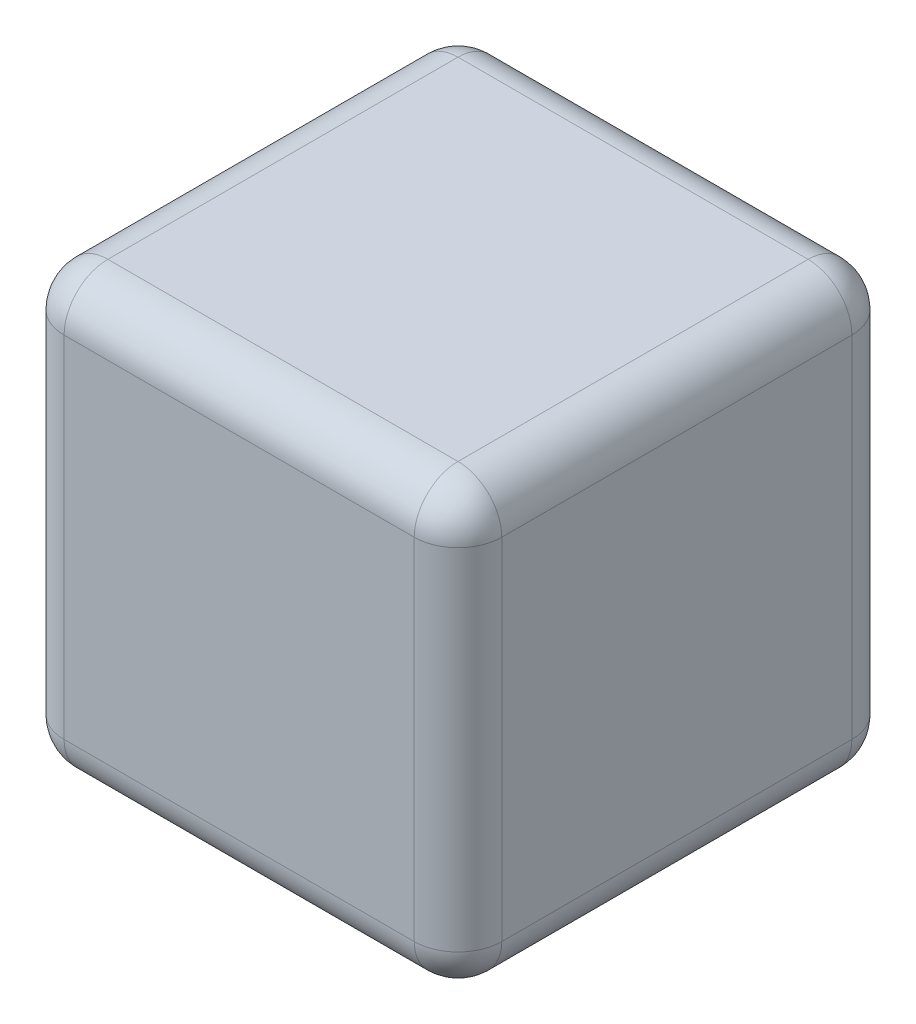
ISO-10303-21;
HEADER;
FILE_DESCRIPTION(('STEP AP214'),'2;1');
FILE_NAME('part.step','',(''),(''),'','','');
FILE_SCHEMA(('AUTOMOTIVE_DESIGN { 1 0 10303 214 1 1 1 1 }'));
ENDSEC;
DATA;
#1=APPLICATION_CONTEXT('core data for automotive mechanical design processes');
#2=APPLICATION_PROTOCOL_DEFINITION('international standard','automotive_design',2000,#1);
#3=PRODUCT_CONTEXT('',#1,'mechanical');
#4=PRODUCT('Part','Part','',(#3));
#5=PRODUCT_RELATED_PRODUCT_CATEGORY('part','',(#4));
#6=PRODUCT_DEFINITION_FORMATION('','',#4);
#7=PRODUCT_DEFINITION_CONTEXT('part definition',#1,'design');
#8=PRODUCT_DEFINITION('design','',#6,#7);
#9=PRODUCT_DEFINITION_SHAPE('','',#8);
#10=(LENGTH_UNIT() NAMED_UNIT(*) SI_UNIT(.MILLI.,.METRE.));
#11=(NAMED_UNIT(*) PLANE_ANGLE_UNIT() SI_UNIT($,.RADIAN.));
#12=(NAMED_UNIT(*) SI_UNIT($,.STERADIAN.) SOLID_ANGLE_UNIT());
#13=UNCERTAINTY_MEASURE_WITH_UNIT(LENGTH_MEASURE(1.E-05),#10,'distance_accuracy_value','');
#14=(GEOMETRIC_REPRESENTATION_CONTEXT(3) GLOBAL_UNCERTAINTY_ASSIGNED_CONTEXT((#13)) GLOBAL_UNIT_ASSIGNED_CONTEXT((#10,
#11,#12)) REPRESENTATION_CONTEXT('',''));
#15=CARTESIAN_POINT('',(0.,0.,0.));
#16=DIRECTION('',(0.,0.,1.));
#17=DIRECTION('',(1.,0.,0.));
#18=AXIS2_PLACEMENT_3D('',#15,#16,#17);
#19=CARTESIAN_POINT('',(0.,63.5,0.));
#20=DIRECTION('',(1.,0.,0.));
#21=DIRECTION('',(0.,0.,-1.));
#22=AXIS2_PLACEMENT_3D('',#19,#20,#21);
#23=PLANE('',#22);
#24=DIRECTION('',(0.,0.,1.));
#25=VECTOR('',#24,1.);
#26=CARTESIAN_POINT('',(0.,6.35,0.));
#27=LINE('',#26,#25);
#28=CARTESIAN_POINT('',(0.,6.35,6.35));
#29=VERTEX_POINT('',#28);
#30=CARTESIAN_POINT('',(0.,6.35,57.15));
#31=VERTEX_POINT('',#30);
#32=EDGE_CURVE('E181',#29,#31,#27,.T.);
#33=ORIENTED_EDGE('',*,*,#32,.T.);
#34=DIRECTION('',(0.,-1.,0.));
#35=VECTOR('',#34,1.);
#36=CARTESIAN_POINT('',(0.,63.5,57.15));
#37=LINE('',#36,#35);
#38=CARTESIAN_POINT('',(0.,57.15,57.15));
#39=VERTEX_POINT('',#38);
#40=EDGE_CURVE('E190',#31,#39,#37,.F.);
#41=ORIENTED_EDGE('',*,*,#40,.T.);
#42=DIRECTION('',(0.,0.,1.));
#43=VECTOR('',#42,1.);
#44=CARTESIAN_POINT('',(0.,57.15,0.));
#45=LINE('',#44,#43);
#46=CARTESIAN_POINT('',(0.,57.15,6.35));
#47=VERTEX_POINT('',#46);
#48=EDGE_CURVE('E187',#39,#47,#45,.F.);
#49=ORIENTED_EDGE('',*,*,#48,.T.);
#50=DIRECTION('',(0.,-1.,0.));
#51=VECTOR('',#50,1.);
#52=CARTESIAN_POINT('',(0.,63.5,6.35));
#53=LINE('',#52,#51);
#54=EDGE_CURVE('E184',#47,#29,#53,.T.);
#55=ORIENTED_EDGE('',*,*,#54,.T.);
#56=EDGE_LOOP('',(#33,#41,#49,#55));
#57=FACE_BOUND('',#56,.T.);
#58=ADVANCED_FACE('F38',(#57),#23,.F.);
#59=CARTESIAN_POINT('',(0.,63.5,63.5));
#60=DIRECTION('',(0.,0.,-1.));
#61=DIRECTION('',(-1.,0.,0.));
#62=AXIS2_PLACEMENT_3D('',#59,#60,#61);
#63=PLANE('',#62);
#64=DIRECTION('',(0.,-1.,0.));
#65=VECTOR('',#64,1.);
#66=CARTESIAN_POINT('',(6.35,63.5,63.5));
#67=LINE('',#66,#65);
#68=CARTESIAN_POINT('',(6.35,57.15,63.5));
#69=VERTEX_POINT('',#68);
#70=CARTESIAN_POINT('',(6.35,6.35,63.5));
#71=VERTEX_POINT('',#70);
#72=EDGE_CURVE('E143',#69,#71,#67,.T.);
#73=ORIENTED_EDGE('',*,*,#72,.T.);
#74=DIRECTION('',(1.,0.,0.));
#75=VECTOR('',#74,1.);
#76=CARTESIAN_POINT('',(0.,6.35,63.5));
#77=LINE('',#76,#75);
#78=CARTESIAN_POINT('',(57.15,6.35,63.5));
#79=VERTEX_POINT('',#78);
#80=EDGE_CURVE('E138',#71,#79,#77,.T.);
#81=ORIENTED_EDGE('',*,*,#80,.T.);
#82=DIRECTION('',(0.,-1.,0.));
#83=VECTOR('',#82,1.);
#84=CARTESIAN_POINT('',(57.15,63.5,63.5));
#85=LINE('',#84,#83);
#86=CARTESIAN_POINT('',(57.15,57.15,63.5));
#87=VERTEX_POINT('',#86);
#88=EDGE_CURVE('E130',#79,#87,#85,.F.);
#89=ORIENTED_EDGE('',*,*,#88,.T.);
#90=DIRECTION('',(1.,0.,0.));
#91=VECTOR('',#90,1.);
#92=CARTESIAN_POINT('',(0.,57.15,63.5));
#93=LINE('',#92,#91);
#94=EDGE_CURVE('E135',#87,#69,#93,.F.);
#95=ORIENTED_EDGE('',*,*,#94,.T.);
#96=EDGE_LOOP('',(#73,#81,#89,#95));
#97=FACE_BOUND('',#96,.T.);
#98=ADVANCED_FACE('F133',(#97),#63,.F.);
#99=CARTESIAN_POINT('',(63.5,63.5,0.));
#100=DIRECTION('',(-1.,0.,0.));
#101=DIRECTION('',(0.,0.,1.));
#102=AXIS2_PLACEMENT_3D('',#99,#100,#101);
#103=PLANE('',#102);
#104=DIRECTION('',(0.,0.,-1.));
#105=VECTOR('',#104,1.);
#106=CARTESIAN_POINT('',(63.5,57.15,63.5));
#107=LINE('',#106,#105);
#108=CARTESIAN_POINT('',(63.5,57.15,6.35));
#109=VERTEX_POINT('',#108);
#110=CARTESIAN_POINT('',(63.5,57.15,57.15));
#111=VERTEX_POINT('',#110);
#112=EDGE_CURVE('E200',#109,#111,#107,.F.);
#113=ORIENTED_EDGE('',*,*,#112,.T.);
#114=DIRECTION('',(0.,-1.,0.));
#115=VECTOR('',#114,1.);
#116=CARTESIAN_POINT('',(63.5,63.5,57.15));
#117=LINE('',#116,#115);
#118=CARTESIAN_POINT('',(63.5,6.35,57.15));
#119=VERTEX_POINT('',#118);
#120=EDGE_CURVE('E151',#111,#119,#117,.T.);
#121=ORIENTED_EDGE('',*,*,#120,.T.);
#122=DIRECTION('',(0.,0.,-1.));
#123=VECTOR('',#122,1.);
#124=CARTESIAN_POINT('',(63.5,6.35,0.));
#125=LINE('',#124,#123);
#126=CARTESIAN_POINT('',(63.5,6.35,6.35));
#127=VERTEX_POINT('',#126);
#128=EDGE_CURVE('E197',#119,#127,#125,.T.);
#129=ORIENTED_EDGE('',*,*,#128,.T.);
#130=DIRECTION('',(0.,-1.,0.));
#131=VECTOR('',#130,1.);
#132=CARTESIAN_POINT('',(63.5,63.5,6.35));
#133=LINE('',#132,#131);
#134=EDGE_CURVE('E194',#127,#109,#133,.F.);
#135=ORIENTED_EDGE('',*,*,#134,.T.);
#136=EDGE_LOOP('',(#113,#121,#129,#135));
#137=FACE_BOUND('',#136,.T.);
#138=ADVANCED_FACE('F363',(#137),#103,.F.);
#139=CARTESIAN_POINT('',(0.,63.5,0.));
#140=DIRECTION('',(0.,0.,1.));
#141=DIRECTION('',(1.,0.,0.));
#142=AXIS2_PLACEMENT_3D('',#139,#140,#141);
#143=PLANE('',#142);
#144=DIRECTION('',(0.,-1.,0.));
#145=VECTOR('',#144,1.);
#146=CARTESIAN_POINT('',(6.35,63.5,0.));
#147=LINE('',#146,#145);
#148=CARTESIAN_POINT('',(6.35,6.35,0.));
#149=VERTEX_POINT('',#148);
#150=CARTESIAN_POINT('',(6.35,57.15,0.));
#151=VERTEX_POINT('',#150);
#152=EDGE_CURVE('E63',#149,#151,#147,.F.);
#153=ORIENTED_EDGE('',*,*,#152,.T.);
#154=DIRECTION('',(-1.,0.,0.));
#155=VECTOR('',#154,1.);
#156=CARTESIAN_POINT('',(63.5,57.15,0.));
#157=LINE('',#156,#155);
#158=CARTESIAN_POINT('',(57.15,57.15,0.));
#159=VERTEX_POINT('',#158);
#160=EDGE_CURVE('E11',#151,#159,#157,.F.);
#161=ORIENTED_EDGE('',*,*,#160,.T.);
#162=DIRECTION('',(0.,-1.,0.));
#163=VECTOR('',#162,1.);
#164=CARTESIAN_POINT('',(57.15,63.5,0.));
#165=LINE('',#164,#163);
#166=CARTESIAN_POINT('',(57.15,6.35,0.));
#167=VERTEX_POINT('',#166);
#168=EDGE_CURVE('E48',#159,#167,#165,.T.);
#169=ORIENTED_EDGE('',*,*,#168,.T.);
#170=DIRECTION('',(-1.,0.,0.));
#171=VECTOR('',#170,1.);
#172=CARTESIAN_POINT('',(0.,6.35,0.));
#173=LINE('',#172,#171);
#174=EDGE_CURVE('E231',#167,#149,#173,.T.);
#175=ORIENTED_EDGE('',*,*,#174,.T.);
#176=EDGE_LOOP('',(#153,#161,#169,#175));
#177=FACE_BOUND('',#176,.T.);
#178=ADVANCED_FACE('F328',(#177),#143,.F.);
#179=CARTESIAN_POINT('',(0.,63.5,0.));
#180=DIRECTION('',(0.,1.,0.));
#181=DIRECTION('',(0.,0.,1.));
#182=AXIS2_PLACEMENT_3D('',#179,#180,#181);
#183=PLANE('',#182);
#184=DIRECTION('',(0.,0.,-1.));
#185=VECTOR('',#184,1.);
#186=CARTESIAN_POINT('',(57.15,63.5,0.));
#187=LINE('',#186,#185);
#188=CARTESIAN_POINT('',(57.15,63.5,57.15));
#189=VERTEX_POINT('',#188);
#190=CARTESIAN_POINT('',(57.15,63.5,6.35));
#191=VERTEX_POINT('',#190);
#192=EDGE_CURVE('E224',#189,#191,#187,.T.);
#193=ORIENTED_EDGE('',*,*,#192,.T.);
#194=DIRECTION('',(-1.,0.,0.));
#195=VECTOR('',#194,1.);
#196=CARTESIAN_POINT('',(0.,63.5,6.35));
#197=LINE('',#196,#195);
#198=CARTESIAN_POINT('',(6.35,63.5,6.35));
#199=VERTEX_POINT('',#198);
#200=EDGE_CURVE('E227',#191,#199,#197,.T.);
#201=ORIENTED_EDGE('',*,*,#200,.T.);
#202=DIRECTION('',(0.,0.,1.));
#203=VECTOR('',#202,1.);
#204=CARTESIAN_POINT('',(6.35,63.5,63.5));
#205=LINE('',#204,#203);
#206=CARTESIAN_POINT('',(6.35,63.5,57.15));
#207=VERTEX_POINT('',#206);
#208=EDGE_CURVE('E218',#199,#207,#205,.T.);
#209=ORIENTED_EDGE('',*,*,#208,.T.);
#210=DIRECTION('',(1.,0.,0.));
#211=VECTOR('',#210,1.);
#212=CARTESIAN_POINT('',(63.5,63.5,57.15));
#213=LINE('',#212,#211);
#214=EDGE_CURVE('E221',#207,#189,#213,.T.);
#215=ORIENTED_EDGE('',*,*,#214,.T.);
#216=EDGE_LOOP('',(#193,#201,#209,#215));
#217=FACE_BOUND('',#216,.T.);
#218=ADVANCED_FACE('F341',(#217),#183,.T.);
#219=CARTESIAN_POINT('',(0.,0.,0.));
#220=DIRECTION('',(0.,1.,0.));
#221=DIRECTION('',(0.,0.,1.));
#222=AXIS2_PLACEMENT_3D('',#219,#220,#221);
#223=PLANE('',#222);
#224=DIRECTION('',(0.,0.,-1.));
#225=VECTOR('',#224,1.);
#226=CARTESIAN_POINT('',(57.15,0.,0.));
#227=LINE('',#226,#225);
#228=CARTESIAN_POINT('',(57.15,0.,6.35));
#229=VERTEX_POINT('',#228);
#230=CARTESIAN_POINT('',(57.15,0.,57.15));
#231=VERTEX_POINT('',#230);
#232=EDGE_CURVE('E211',#229,#231,#227,.F.);
#233=ORIENTED_EDGE('',*,*,#232,.T.);
#234=DIRECTION('',(1.,0.,0.));
#235=VECTOR('',#234,1.);
#236=CARTESIAN_POINT('',(0.,0.,57.15));
#237=LINE('',#236,#235);
#238=CARTESIAN_POINT('',(6.35,0.,57.15));
#239=VERTEX_POINT('',#238);
#240=EDGE_CURVE('E214',#231,#239,#237,.F.);
#241=ORIENTED_EDGE('',*,*,#240,.T.);
#242=DIRECTION('',(0.,0.,1.));
#243=VECTOR('',#242,1.);
#244=CARTESIAN_POINT('',(6.35,0.,0.));
#245=LINE('',#244,#243);
#246=CARTESIAN_POINT('',(6.35,0.,6.35));
#247=VERTEX_POINT('',#246);
#248=EDGE_CURVE('E208',#239,#247,#245,.F.);
#249=ORIENTED_EDGE('',*,*,#248,.T.);
#250=DIRECTION('',(-1.,0.,0.));
#251=VECTOR('',#250,1.);
#252=CARTESIAN_POINT('',(0.,0.,6.35));
#253=LINE('',#252,#251);
#254=EDGE_CURVE('E205',#247,#229,#253,.F.);
#255=ORIENTED_EDGE('',*,*,#254,.T.);
#256=EDGE_LOOP('',(#233,#241,#249,#255));
#257=FACE_BOUND('',#256,.T.);
#258=ADVANCED_FACE('F321',(#257),#223,.F.);
#259=CARTESIAN_POINT('',(57.15,63.5,6.35));
#260=DIRECTION('',(0.,-1.,0.));
#261=DIRECTION('',(0.,0.,-1.));
#262=AXIS2_PLACEMENT_3D('',#259,#260,#261);
#263=CYLINDRICAL_SURFACE('',#262,6.35);
#264=CARTESIAN_POINT('',(57.15,57.15,6.35));
#265=DIRECTION('',(0.,1.,0.));
#266=DIRECTION('',(0.,0.,1.));
#267=AXIS2_PLACEMENT_3D('',#264,#265,#266);
#268=CIRCLE('',#267,6.35);
#269=EDGE_CURVE('E42',#109,#159,#268,.T.);
#270=ORIENTED_EDGE('',*,*,#269,.F.);
#271=ORIENTED_EDGE('',*,*,#134,.F.);
#272=CARTESIAN_POINT('',(57.15,6.35,6.35));
#273=DIRECTION('',(0.,-1.,0.));
#274=DIRECTION('',(0.,0.,-1.));
#275=AXIS2_PLACEMENT_3D('',#272,#273,#274);
#276=CIRCLE('',#275,6.35);
#277=EDGE_CURVE('E175',#167,#127,#276,.T.);
#278=ORIENTED_EDGE('',*,*,#277,.F.);
#279=ORIENTED_EDGE('',*,*,#168,.F.);
#280=EDGE_LOOP('',(#270,#271,#278,#279));
#281=FACE_BOUND('',#280,.T.);
#282=ADVANCED_FACE('F40',(#281),#263,.T.);
#283=CARTESIAN_POINT('',(57.15,57.15,6.35));
#284=DIRECTION('',(0.,0.,-1.));
#285=DIRECTION('',(-1.,0.,0.));
#286=AXIS2_PLACEMENT_3D('',#283,#284,#285);
#287=SPHERICAL_SURFACE('',#286,6.35);
#288=CARTESIAN_POINT('',(57.15,57.15,6.35));
#289=DIRECTION('',(0.,0.,-1.));
#290=DIRECTION('',(-1.,0.,0.));
#291=AXIS2_PLACEMENT_3D('',#288,#289,#290);
#292=CIRCLE('',#291,6.35);
#293=EDGE_CURVE('E298',#109,#191,#292,.F.);
#294=ORIENTED_EDGE('',*,*,#293,.F.);
#295=ORIENTED_EDGE('',*,*,#269,.T.);
#296=CARTESIAN_POINT('',(57.15,57.15,6.35));
#297=DIRECTION('',(1.,0.,0.));
#298=DIRECTION('',(0.,0.,-1.));
#299=AXIS2_PLACEMENT_3D('',#296,#297,#298);
#300=CIRCLE('',#299,6.35);
#301=EDGE_CURVE('E56',#191,#159,#300,.F.);
#302=ORIENTED_EDGE('',*,*,#301,.F.);
#303=EDGE_LOOP('',(#294,#295,#302));
#304=FACE_BOUND('',#303,.T.);
#305=ADVANCED_FACE('F348',(#304),#287,.T.);
#306=CARTESIAN_POINT('',(57.15,6.35,6.35));
#307=DIRECTION('',(1.,0.,0.));
#308=DIRECTION('',(0.,1.,0.));
#309=AXIS2_PLACEMENT_3D('',#306,#307,#308);
#310=SPHERICAL_SURFACE('',#309,6.35);
#311=CARTESIAN_POINT('',(57.15,6.35,6.35));
#312=DIRECTION('',(1.,0.,0.));
#313=DIRECTION('',(0.,0.,-1.));
#314=AXIS2_PLACEMENT_3D('',#311,#312,#313);
#315=CIRCLE('',#314,6.35);
#316=EDGE_CURVE('E290',#167,#229,#315,.F.);
#317=ORIENTED_EDGE('',*,*,#316,.F.);
#318=ORIENTED_EDGE('',*,*,#277,.T.);
#319=CARTESIAN_POINT('',(57.15,6.35,6.35));
#320=DIRECTION('',(0.,0.,-1.));
#321=DIRECTION('',(-1.,0.,0.));
#322=AXIS2_PLACEMENT_3D('',#319,#320,#321);
#323=CIRCLE('',#322,6.35);
#324=EDGE_CURVE('E294',#229,#127,#323,.F.);
#325=ORIENTED_EDGE('',*,*,#324,.F.);
#326=EDGE_LOOP('',(#317,#318,#325));
#327=FACE_BOUND('',#326,.T.);
#328=ADVANCED_FACE('F309',(#327),#310,.T.);
#329=CARTESIAN_POINT('',(0.,57.15,6.35));
#330=DIRECTION('',(1.,0.,0.));
#331=DIRECTION('',(0.,0.,-1.));
#332=AXIS2_PLACEMENT_3D('',#329,#330,#331);
#333=CYLINDRICAL_SURFACE('',#332,6.35);
#334=ORIENTED_EDGE('',*,*,#301,.T.);
#335=ORIENTED_EDGE('',*,*,#160,.F.);
#336=CARTESIAN_POINT('',(6.35,57.15,6.35));
#337=DIRECTION('',(-1.,0.,0.));
#338=DIRECTION('',(0.,0.,1.));
#339=AXIS2_PLACEMENT_3D('',#336,#337,#338);
#340=CIRCLE('',#339,6.35);
#341=EDGE_CURVE('E282',#199,#151,#340,.T.);
#342=ORIENTED_EDGE('',*,*,#341,.F.);
#343=ORIENTED_EDGE('',*,*,#200,.F.);
#344=EDGE_LOOP('',(#334,#335,#342,#343));
#345=FACE_BOUND('',#344,.T.);
#346=ADVANCED_FACE('F339',(#345),#333,.T.);
#347=CARTESIAN_POINT('',(57.15,57.15,0.));
#348=DIRECTION('',(0.,0.,1.));
#349=DIRECTION('',(1.,0.,0.));
#350=AXIS2_PLACEMENT_3D('',#347,#348,#349);
#351=CYLINDRICAL_SURFACE('',#350,6.35);
#352=ORIENTED_EDGE('',*,*,#293,.T.);
#353=ORIENTED_EDGE('',*,*,#192,.F.);
#354=CARTESIAN_POINT('',(57.15,57.15,57.15));
#355=DIRECTION('',(0.,0.,1.));
#356=DIRECTION('',(1.,0.,0.));
#357=AXIS2_PLACEMENT_3D('',#354,#355,#356);
#358=CIRCLE('',#357,6.35);
#359=EDGE_CURVE('E156',#111,#189,#358,.T.);
#360=ORIENTED_EDGE('',*,*,#359,.F.);
#361=ORIENTED_EDGE('',*,*,#112,.F.);
#362=EDGE_LOOP('',(#352,#353,#360,#361));
#363=FACE_BOUND('',#362,.T.);
#364=ADVANCED_FACE('F346',(#363),#351,.T.);
#365=CARTESIAN_POINT('',(57.15,63.5,57.15));
#366=DIRECTION('',(0.,-1.,0.));
#367=DIRECTION('',(0.,0.,-1.));
#368=AXIS2_PLACEMENT_3D('',#365,#366,#367);
#369=CYLINDRICAL_SURFACE('',#368,6.35);
#370=CARTESIAN_POINT('',(57.15,6.35,57.15));
#371=DIRECTION('',(0.,-1.,0.));
#372=DIRECTION('',(0.,0.,-1.));
#373=AXIS2_PLACEMENT_3D('',#370,#371,#372);
#374=CIRCLE('',#373,6.35);
#375=EDGE_CURVE('E157',#119,#79,#374,.T.);
#376=ORIENTED_EDGE('',*,*,#375,.F.);
#377=ORIENTED_EDGE('',*,*,#120,.F.);
#378=CARTESIAN_POINT('',(57.15,57.15,57.15));
#379=DIRECTION('',(0.,1.,0.));
#380=DIRECTION('',(0.,0.,1.));
#381=AXIS2_PLACEMENT_3D('',#378,#379,#380);
#382=CIRCLE('',#381,6.35);
#383=EDGE_CURVE('E147',#87,#111,#382,.T.);
#384=ORIENTED_EDGE('',*,*,#383,.F.);
#385=ORIENTED_EDGE('',*,*,#88,.F.);
#386=EDGE_LOOP('',(#376,#377,#384,#385));
#387=FACE_BOUND('',#386,.T.);
#388=ADVANCED_FACE('F149',(#387),#369,.T.);
#389=CARTESIAN_POINT('',(57.15,6.35,0.));
#390=DIRECTION('',(0.,0.,-1.));
#391=DIRECTION('',(-1.,0.,0.));
#392=AXIS2_PLACEMENT_3D('',#389,#390,#391);
#393=CYLINDRICAL_SURFACE('',#392,6.35);
#394=ORIENTED_EDGE('',*,*,#324,.T.);
#395=ORIENTED_EDGE('',*,*,#128,.F.);
#396=CARTESIAN_POINT('',(57.15,6.35,57.15));
#397=DIRECTION('',(0.,0.,1.));
#398=DIRECTION('',(1.,0.,0.));
#399=AXIS2_PLACEMENT_3D('',#396,#397,#398);
#400=CIRCLE('',#399,6.35);
#401=EDGE_CURVE('E275',#231,#119,#400,.T.);
#402=ORIENTED_EDGE('',*,*,#401,.F.);
#403=ORIENTED_EDGE('',*,*,#232,.F.);
#404=EDGE_LOOP('',(#394,#395,#402,#403));
#405=FACE_BOUND('',#404,.T.);
#406=ADVANCED_FACE('F317',(#405),#393,.T.);
#407=CARTESIAN_POINT('',(0.,6.35,6.35));
#408=DIRECTION('',(-1.,0.,0.));
#409=DIRECTION('',(0.,0.,1.));
#410=AXIS2_PLACEMENT_3D('',#407,#408,#409);
#411=CYLINDRICAL_SURFACE('',#410,6.35);
#412=ORIENTED_EDGE('',*,*,#316,.T.);
#413=ORIENTED_EDGE('',*,*,#254,.F.);
#414=CARTESIAN_POINT('',(6.35,6.35,6.35));
#415=DIRECTION('',(-1.,0.,0.));
#416=DIRECTION('',(0.,0.,1.));
#417=AXIS2_PLACEMENT_3D('',#414,#415,#416);
#418=CIRCLE('',#417,6.35);
#419=EDGE_CURVE('E271',#149,#247,#418,.T.);
#420=ORIENTED_EDGE('',*,*,#419,.F.);
#421=ORIENTED_EDGE('',*,*,#174,.F.);
#422=EDGE_LOOP('',(#412,#413,#420,#421));
#423=FACE_BOUND('',#422,.T.);
#424=ADVANCED_FACE('F327',(#423),#411,.T.);
#425=CARTESIAN_POINT('',(6.35,63.5,6.35));
#426=DIRECTION('',(0.,-1.,0.));
#427=DIRECTION('',(0.,0.,-1.));
#428=AXIS2_PLACEMENT_3D('',#425,#426,#427);
#429=CYLINDRICAL_SURFACE('',#428,6.35);
#430=CARTESIAN_POINT('',(6.35,57.15,6.35));
#431=DIRECTION('',(0.,1.,0.));
#432=DIRECTION('',(0.,0.,1.));
#433=AXIS2_PLACEMENT_3D('',#430,#431,#432);
#434=CIRCLE('',#433,6.35);
#435=EDGE_CURVE('E286',#151,#47,#434,.T.);
#436=ORIENTED_EDGE('',*,*,#435,.F.);
#437=ORIENTED_EDGE('',*,*,#152,.F.);
#438=CARTESIAN_POINT('',(6.35,6.35,6.35));
#439=DIRECTION('',(0.,-1.,0.));
#440=DIRECTION('',(0.,0.,-1.));
#441=AXIS2_PLACEMENT_3D('',#438,#439,#440);
#442=CIRCLE('',#441,6.35);
#443=EDGE_CURVE('E267',#29,#149,#442,.T.);
#444=ORIENTED_EDGE('',*,*,#443,.F.);
#445=ORIENTED_EDGE('',*,*,#54,.F.);
#446=EDGE_LOOP('',(#436,#437,#444,#445));
#447=FACE_BOUND('',#446,.T.);
#448=ADVANCED_FACE('F332',(#447),#429,.T.);
#449=CARTESIAN_POINT('',(6.35,57.15,6.35));
#450=DIRECTION('',(0.,0.,-1.));
#451=DIRECTION('',(-1.,0.,0.));
#452=AXIS2_PLACEMENT_3D('',#449,#450,#451);
#453=SPHERICAL_SURFACE('',#452,6.35);
#454=ORIENTED_EDGE('',*,*,#341,.T.);
#455=ORIENTED_EDGE('',*,*,#435,.T.);
#456=CARTESIAN_POINT('',(6.35,57.15,6.35));
#457=DIRECTION('',(0.,0.,-1.));
#458=DIRECTION('',(-1.,0.,0.));
#459=AXIS2_PLACEMENT_3D('',#456,#457,#458);
#460=CIRCLE('',#459,6.35);
#461=EDGE_CURVE('E165',#199,#47,#460,.F.);
#462=ORIENTED_EDGE('',*,*,#461,.F.);
#463=EDGE_LOOP('',(#454,#455,#462));
#464=FACE_BOUND('',#463,.T.);
#465=ADVANCED_FACE('F338',(#464),#453,.T.);
#466=CARTESIAN_POINT('',(57.15,57.15,57.15));
#467=DIRECTION('',(1.,0.,0.));
#468=DIRECTION('',(0.,0.,-1.));
#469=AXIS2_PLACEMENT_3D('',#466,#467,#468);
#470=SPHERICAL_SURFACE('',#469,6.35);
#471=ORIENTED_EDGE('',*,*,#383,.T.);
#472=ORIENTED_EDGE('',*,*,#359,.T.);
#473=CARTESIAN_POINT('',(57.15,57.15,57.15));
#474=DIRECTION('',(1.,0.,0.));
#475=DIRECTION('',(0.,0.,-1.));
#476=AXIS2_PLACEMENT_3D('',#473,#474,#475);
#477=CIRCLE('',#476,6.35);
#478=EDGE_CURVE('E160',#87,#189,#477,.F.);
#479=ORIENTED_EDGE('',*,*,#478,.F.);
#480=EDGE_LOOP('',(#471,#472,#479));
#481=FACE_BOUND('',#480,.T.);
#482=ADVANCED_FACE('F161',(#481),#470,.T.);
#483=CARTESIAN_POINT('',(57.15,6.35,57.15));
#484=DIRECTION('',(1.,0.,0.));
#485=DIRECTION('',(0.,1.,0.));
#486=AXIS2_PLACEMENT_3D('',#483,#484,#485);
#487=SPHERICAL_SURFACE('',#486,6.35);
#488=ORIENTED_EDGE('',*,*,#401,.T.);
#489=ORIENTED_EDGE('',*,*,#375,.T.);
#490=CARTESIAN_POINT('',(57.15,6.35,57.15));
#491=DIRECTION('',(1.,0.,0.));
#492=DIRECTION('',(0.,0.,-1.));
#493=AXIS2_PLACEMENT_3D('',#490,#491,#492);
#494=CIRCLE('',#493,6.35);
#495=EDGE_CURVE('E166',#231,#79,#494,.F.);
#496=ORIENTED_EDGE('',*,*,#495,.F.);
#497=EDGE_LOOP('',(#488,#489,#496));
#498=FACE_BOUND('',#497,.T.);
#499=ADVANCED_FACE('F396',(#498),#487,.T.);
#500=CARTESIAN_POINT('',(6.35,6.35,6.35));
#501=DIRECTION('',(0.,0.,-1.));
#502=DIRECTION('',(0.,1.,0.));
#503=AXIS2_PLACEMENT_3D('',#500,#501,#502);
#504=SPHERICAL_SURFACE('',#503,6.35);
#505=ORIENTED_EDGE('',*,*,#443,.T.);
#506=ORIENTED_EDGE('',*,*,#419,.T.);
#507=CARTESIAN_POINT('',(6.35,6.35,6.35));
#508=DIRECTION('',(0.,0.,-1.));
#509=DIRECTION('',(-1.,0.,0.));
#510=AXIS2_PLACEMENT_3D('',#507,#508,#509);
#511=CIRCLE('',#510,6.35);
#512=EDGE_CURVE('E257',#29,#247,#511,.F.);
#513=ORIENTED_EDGE('',*,*,#512,.F.);
#514=EDGE_LOOP('',(#505,#506,#513));
#515=FACE_BOUND('',#514,.T.);
#516=ADVANCED_FACE('F392',(#515),#504,.T.);
#517=CARTESIAN_POINT('',(6.35,57.15,0.));
#518=DIRECTION('',(0.,0.,-1.));
#519=DIRECTION('',(-1.,0.,0.));
#520=AXIS2_PLACEMENT_3D('',#517,#518,#519);
#521=CYLINDRICAL_SURFACE('',#520,6.35);
#522=ORIENTED_EDGE('',*,*,#461,.T.);
#523=ORIENTED_EDGE('',*,*,#48,.F.);
#524=CARTESIAN_POINT('',(6.35,57.15,57.15));
#525=DIRECTION('',(0.,0.,1.));
#526=DIRECTION('',(1.,0.,0.));
#527=AXIS2_PLACEMENT_3D('',#524,#525,#526);
#528=CIRCLE('',#527,6.35);
#529=EDGE_CURVE('E253',#207,#39,#528,.T.);
#530=ORIENTED_EDGE('',*,*,#529,.F.);
#531=ORIENTED_EDGE('',*,*,#208,.F.);
#532=EDGE_LOOP('',(#522,#523,#530,#531));
#533=FACE_BOUND('',#532,.T.);
#534=ADVANCED_FACE('F389',(#533),#521,.T.);
#535=CARTESIAN_POINT('',(0.,57.15,57.15));
#536=DIRECTION('',(-1.,0.,0.));
#537=DIRECTION('',(0.,0.,1.));
#538=AXIS2_PLACEMENT_3D('',#535,#536,#537);
#539=CYLINDRICAL_SURFACE('',#538,6.35);
#540=ORIENTED_EDGE('',*,*,#478,.T.);
#541=ORIENTED_EDGE('',*,*,#214,.F.);
#542=CARTESIAN_POINT('',(6.35,57.15,57.15));
#543=DIRECTION('',(-1.,0.,0.));
#544=DIRECTION('',(0.,0.,1.));
#545=AXIS2_PLACEMENT_3D('',#542,#543,#544);
#546=CIRCLE('',#545,6.35);
#547=EDGE_CURVE('E170',#69,#207,#546,.T.);
#548=ORIENTED_EDGE('',*,*,#547,.F.);
#549=ORIENTED_EDGE('',*,*,#94,.F.);
#550=EDGE_LOOP('',(#540,#541,#548,#549));
#551=FACE_BOUND('',#550,.T.);
#552=ADVANCED_FACE('F168',(#551),#539,.T.);
#553=CARTESIAN_POINT('',(0.,6.35,57.15));
#554=DIRECTION('',(1.,0.,0.));
#555=DIRECTION('',(0.,0.,-1.));
#556=AXIS2_PLACEMENT_3D('',#553,#554,#555);
#557=CYLINDRICAL_SURFACE('',#556,6.35);
#558=ORIENTED_EDGE('',*,*,#495,.T.);
#559=ORIENTED_EDGE('',*,*,#80,.F.);
#560=CARTESIAN_POINT('',(6.35,6.35,57.15));
#561=DIRECTION('',(-1.,0.,0.));
#562=DIRECTION('',(0.,0.,1.));
#563=AXIS2_PLACEMENT_3D('',#560,#561,#562);
#564=CIRCLE('',#563,6.35);
#565=EDGE_CURVE('E247',#239,#71,#564,.T.);
#566=ORIENTED_EDGE('',*,*,#565,.F.);
#567=ORIENTED_EDGE('',*,*,#240,.F.);
#568=EDGE_LOOP('',(#558,#559,#566,#567));
#569=FACE_BOUND('',#568,.T.);
#570=ADVANCED_FACE('F382',(#569),#557,.T.);
#571=CARTESIAN_POINT('',(6.35,6.35,0.));
#572=DIRECTION('',(0.,0.,1.));
#573=DIRECTION('',(1.,0.,0.));
#574=AXIS2_PLACEMENT_3D('',#571,#572,#573);
#575=CYLINDRICAL_SURFACE('',#574,6.35);
#576=ORIENTED_EDGE('',*,*,#512,.T.);
#577=ORIENTED_EDGE('',*,*,#248,.F.);
#578=CARTESIAN_POINT('',(6.35,6.35,57.15));
#579=DIRECTION('',(0.,0.,1.));
#580=DIRECTION('',(1.,0.,0.));
#581=AXIS2_PLACEMENT_3D('',#578,#579,#580);
#582=CIRCLE('',#581,6.35);
#583=EDGE_CURVE('E244',#31,#239,#582,.T.);
#584=ORIENTED_EDGE('',*,*,#583,.F.);
#585=ORIENTED_EDGE('',*,*,#32,.F.);
#586=EDGE_LOOP('',(#576,#577,#584,#585));
#587=FACE_BOUND('',#586,.T.);
#588=ADVANCED_FACE('F378',(#587),#575,.T.);
#589=CARTESIAN_POINT('',(6.35,57.15,57.15));
#590=DIRECTION('',(0.,1.,0.));
#591=DIRECTION('',(0.,0.,1.));
#592=AXIS2_PLACEMENT_3D('',#589,#590,#591);
#593=SPHERICAL_SURFACE('',#592,6.35);
#594=ORIENTED_EDGE('',*,*,#547,.T.);
#595=ORIENTED_EDGE('',*,*,#529,.T.);
#596=CARTESIAN_POINT('',(6.35,57.15,57.15));
#597=DIRECTION('',(0.,1.,0.));
#598=DIRECTION('',(0.,0.,1.));
#599=AXIS2_PLACEMENT_3D('',#596,#597,#598);
#600=CIRCLE('',#599,6.35);
#601=EDGE_CURVE('E241',#69,#39,#600,.F.);
#602=ORIENTED_EDGE('',*,*,#601,.F.);
#603=EDGE_LOOP('',(#594,#595,#602));
#604=FACE_BOUND('',#603,.T.);
#605=ADVANCED_FACE('F374',(#604),#593,.T.);
#606=CARTESIAN_POINT('',(6.35,6.35,57.15));
#607=DIRECTION('',(0.,-1.,0.));
#608=DIRECTION('',(0.,0.,-1.));
#609=AXIS2_PLACEMENT_3D('',#606,#607,#608);
#610=SPHERICAL_SURFACE('',#609,6.35);
#611=ORIENTED_EDGE('',*,*,#583,.T.);
#612=ORIENTED_EDGE('',*,*,#565,.T.);
#613=CARTESIAN_POINT('',(6.35,6.35,57.15));
#614=DIRECTION('',(0.,-1.,0.));
#615=DIRECTION('',(0.,0.,-1.));
#616=AXIS2_PLACEMENT_3D('',#613,#614,#615);
#617=CIRCLE('',#616,6.35);
#618=EDGE_CURVE('E238',#31,#71,#617,.F.);
#619=ORIENTED_EDGE('',*,*,#618,.F.);
#620=EDGE_LOOP('',(#611,#612,#619));
#621=FACE_BOUND('',#620,.T.);
#622=ADVANCED_FACE('F370',(#621),#610,.T.);
#623=CARTESIAN_POINT('',(6.35,63.5,57.15));
#624=DIRECTION('',(0.,-1.,0.));
#625=DIRECTION('',(0.,0.,-1.));
#626=AXIS2_PLACEMENT_3D('',#623,#624,#625);
#627=CYLINDRICAL_SURFACE('',#626,6.35);
#628=ORIENTED_EDGE('',*,*,#601,.T.);
#629=ORIENTED_EDGE('',*,*,#40,.F.);
#630=ORIENTED_EDGE('',*,*,#618,.T.);
#631=ORIENTED_EDGE('',*,*,#72,.F.);
#632=EDGE_LOOP('',(#628,#629,#630,#631));
#633=FACE_BOUND('',#632,.T.);
#634=ADVANCED_FACE('F367',(#633),#627,.T.);
#635=CLOSED_SHELL('',(#58,#98,#138,#178,#218,#258,#282,#305,#328,#346,#364,#388,#406,#424,#448,
#465,#482,#499,#516,#534,#552,#570,#588,#605,#622,#634));
#636=MANIFOLD_SOLID_BREP('B2',#635);
#637=ADVANCED_BREP_SHAPE_REPRESENTATION('',(#18,#636),#14);
#638=SHAPE_DEFINITION_REPRESENTATION(#9,#637);
ENDSEC;
END-ISO-10303-21;
